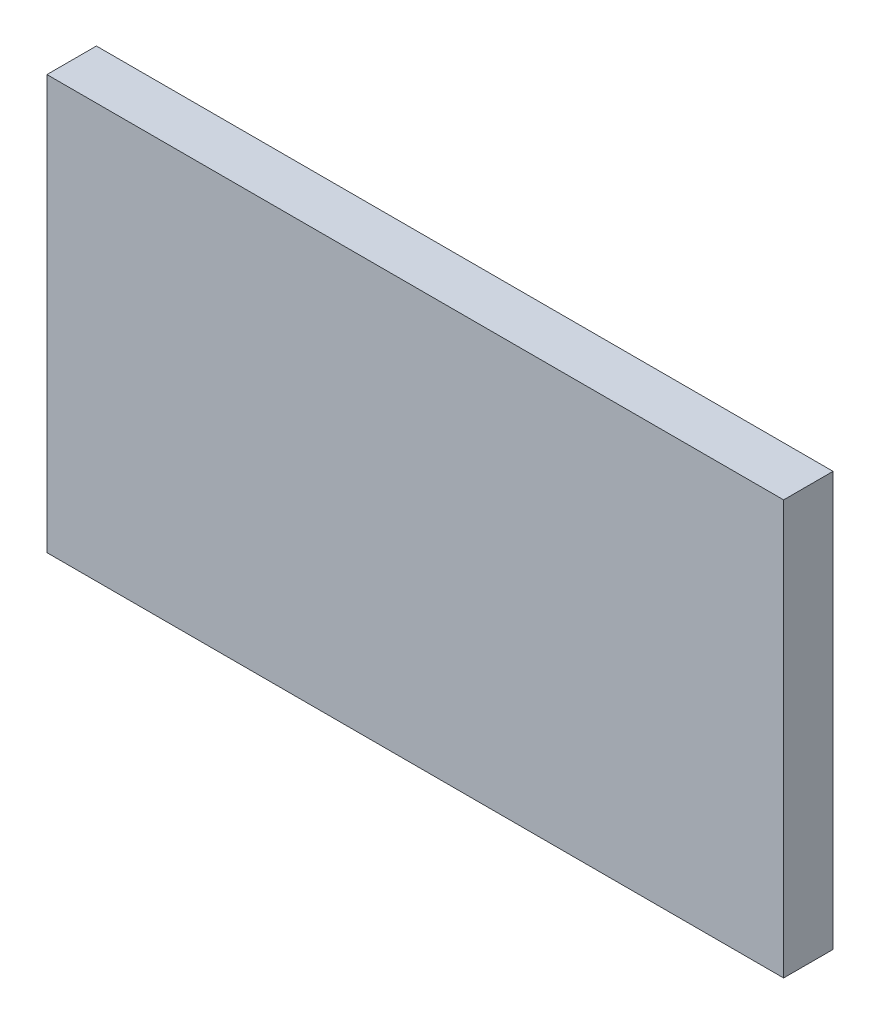
ISO-10303-21;
HEADER;
FILE_DESCRIPTION(('STEP AP214'),'2;1');
FILE_NAME('part.step','',(''),(''),'','','');
FILE_SCHEMA(('AUTOMOTIVE_DESIGN { 1 0 10303 214 1 1 1 1 }'));
ENDSEC;
DATA;
#1=APPLICATION_CONTEXT('core data for automotive mechanical design processes');
#2=APPLICATION_PROTOCOL_DEFINITION('international standard','automotive_design',2000,#1);
#3=PRODUCT_CONTEXT('',#1,'mechanical');
#4=PRODUCT('Part','Part','',(#3));
#5=PRODUCT_RELATED_PRODUCT_CATEGORY('part','',(#4));
#6=PRODUCT_DEFINITION_FORMATION('','',#4);
#7=PRODUCT_DEFINITION_CONTEXT('part definition',#1,'design');
#8=PRODUCT_DEFINITION('design','',#6,#7);
#9=PRODUCT_DEFINITION_SHAPE('','',#8);
#10=(LENGTH_UNIT() NAMED_UNIT(*) SI_UNIT(.MILLI.,.METRE.));
#11=(NAMED_UNIT(*) PLANE_ANGLE_UNIT() SI_UNIT($,.RADIAN.));
#12=(NAMED_UNIT(*) SI_UNIT($,.STERADIAN.) SOLID_ANGLE_UNIT());
#13=UNCERTAINTY_MEASURE_WITH_UNIT(LENGTH_MEASURE(1.E-05),#10,'distance_accuracy_value','');
#14=(GEOMETRIC_REPRESENTATION_CONTEXT(3) GLOBAL_UNCERTAINTY_ASSIGNED_CONTEXT((#13)) GLOBAL_UNIT_ASSIGNED_CONTEXT((#10,
#11,#12)) REPRESENTATION_CONTEXT('',''));
#15=CARTESIAN_POINT('',(0.,0.,0.));
#16=DIRECTION('',(0.,0.,1.));
#17=DIRECTION('',(1.,0.,0.));
#18=AXIS2_PLACEMENT_3D('',#15,#16,#17);
#19=CARTESIAN_POINT('',(-298.,-167.5,40.));
#20=DIRECTION('',(1.,0.,0.));
#21=DIRECTION('',(0.,0.,-1.));
#22=AXIS2_PLACEMENT_3D('',#19,#20,#21);
#23=PLANE('',#22);
#24=DIRECTION('',(0.,-1.,0.));
#25=VECTOR('',#24,1.);
#26=CARTESIAN_POINT('',(-298.,-167.5,0.));
#27=LINE('',#26,#25);
#28=CARTESIAN_POINT('',(-298.,167.5,0.));
#29=VERTEX_POINT('',#28);
#30=CARTESIAN_POINT('',(-298.,-167.5,0.));
#31=VERTEX_POINT('',#30);
#32=EDGE_CURVE('E96',#29,#31,#27,.T.);
#33=ORIENTED_EDGE('',*,*,#32,.T.);
#34=DIRECTION('',(0.,0.,-1.));
#35=VECTOR('',#34,1.);
#36=CARTESIAN_POINT('',(-298.,-167.5,40.));
#37=LINE('',#36,#35);
#38=CARTESIAN_POINT('',(-298.,-167.5,40.));
#39=VERTEX_POINT('',#38);
#40=EDGE_CURVE('E11',#39,#31,#37,.T.);
#41=ORIENTED_EDGE('',*,*,#40,.F.);
#42=DIRECTION('',(0.,-1.,0.));
#43=VECTOR('',#42,1.);
#44=CARTESIAN_POINT('',(-298.,-167.5,40.));
#45=LINE('',#44,#43);
#46=CARTESIAN_POINT('',(-298.,167.5,40.));
#47=VERTEX_POINT('',#46);
#48=EDGE_CURVE('E84',#47,#39,#45,.T.);
#49=ORIENTED_EDGE('',*,*,#48,.F.);
#50=DIRECTION('',(0.,0.,-1.));
#51=VECTOR('',#50,1.);
#52=CARTESIAN_POINT('',(-298.,167.5,40.));
#53=LINE('',#52,#51);
#54=EDGE_CURVE('E92',#47,#29,#53,.T.);
#55=ORIENTED_EDGE('',*,*,#54,.T.);
#56=EDGE_LOOP('',(#33,#41,#49,#55));
#57=FACE_BOUND('',#56,.T.);
#58=ADVANCED_FACE('F33',(#57),#23,.F.);
#59=CARTESIAN_POINT('',(298.,-167.5,40.));
#60=DIRECTION('',(0.,1.,0.));
#61=DIRECTION('',(-1.,0.,0.));
#62=AXIS2_PLACEMENT_3D('',#59,#60,#61);
#63=PLANE('',#62);
#64=DIRECTION('',(1.,0.,0.));
#65=VECTOR('',#64,1.);
#66=CARTESIAN_POINT('',(298.,-167.5,0.));
#67=LINE('',#66,#65);
#68=CARTESIAN_POINT('',(298.,-167.5,0.));
#69=VERTEX_POINT('',#68);
#70=EDGE_CURVE('E88',#31,#69,#67,.T.);
#71=ORIENTED_EDGE('',*,*,#70,.T.);
#72=DIRECTION('',(0.,0.,-1.));
#73=VECTOR('',#72,1.);
#74=CARTESIAN_POINT('',(298.,-167.5,40.));
#75=LINE('',#74,#73);
#76=CARTESIAN_POINT('',(298.,-167.5,40.));
#77=VERTEX_POINT('',#76);
#78=EDGE_CURVE('E41',#77,#69,#75,.T.);
#79=ORIENTED_EDGE('',*,*,#78,.F.);
#80=DIRECTION('',(1.,0.,0.));
#81=VECTOR('',#80,1.);
#82=CARTESIAN_POINT('',(298.,-167.5,40.));
#83=LINE('',#82,#81);
#84=EDGE_CURVE('E79',#39,#77,#83,.T.);
#85=ORIENTED_EDGE('',*,*,#84,.F.);
#86=ORIENTED_EDGE('',*,*,#40,.T.);
#87=EDGE_LOOP('',(#71,#79,#85,#86));
#88=FACE_BOUND('',#87,.T.);
#89=ADVANCED_FACE('F87',(#88),#63,.F.);
#90=CARTESIAN_POINT('',(298.,-167.5,40.));
#91=DIRECTION('',(-1.,0.,0.));
#92=DIRECTION('',(0.,0.,1.));
#93=AXIS2_PLACEMENT_3D('',#90,#91,#92);
#94=PLANE('',#93);
#95=DIRECTION('',(0.,1.,0.));
#96=VECTOR('',#95,1.);
#97=CARTESIAN_POINT('',(298.,-167.5,0.));
#98=LINE('',#97,#96);
#99=CARTESIAN_POINT('',(298.,167.5,0.));
#100=VERTEX_POINT('',#99);
#101=EDGE_CURVE('E66',#69,#100,#98,.T.);
#102=ORIENTED_EDGE('',*,*,#101,.T.);
#103=DIRECTION('',(0.,0.,-1.));
#104=VECTOR('',#103,1.);
#105=CARTESIAN_POINT('',(298.,167.5,40.));
#106=LINE('',#105,#104);
#107=CARTESIAN_POINT('',(298.,167.5,40.));
#108=VERTEX_POINT('',#107);
#109=EDGE_CURVE('E89',#108,#100,#106,.T.);
#110=ORIENTED_EDGE('',*,*,#109,.F.);
#111=DIRECTION('',(0.,1.,0.));
#112=VECTOR('',#111,1.);
#113=CARTESIAN_POINT('',(298.,-167.5,40.));
#114=LINE('',#113,#112);
#115=EDGE_CURVE('E82',#77,#108,#114,.T.);
#116=ORIENTED_EDGE('',*,*,#115,.F.);
#117=ORIENTED_EDGE('',*,*,#78,.T.);
#118=EDGE_LOOP('',(#102,#110,#116,#117));
#119=FACE_BOUND('',#118,.T.);
#120=ADVANCED_FACE('F90',(#119),#94,.F.);
#121=CARTESIAN_POINT('',(298.,167.5,40.));
#122=DIRECTION('',(0.,-1.,0.));
#123=DIRECTION('',(1.,0.,0.));
#124=AXIS2_PLACEMENT_3D('',#121,#122,#123);
#125=PLANE('',#124);
#126=DIRECTION('',(-1.,0.,0.));
#127=VECTOR('',#126,1.);
#128=CARTESIAN_POINT('',(298.,167.5,0.));
#129=LINE('',#128,#127);
#130=EDGE_CURVE('E72',#100,#29,#129,.T.);
#131=ORIENTED_EDGE('',*,*,#130,.T.);
#132=ORIENTED_EDGE('',*,*,#54,.F.);
#133=DIRECTION('',(-1.,0.,0.));
#134=VECTOR('',#133,1.);
#135=CARTESIAN_POINT('',(298.,167.5,40.));
#136=LINE('',#135,#134);
#137=EDGE_CURVE('E49',#108,#47,#136,.T.);
#138=ORIENTED_EDGE('',*,*,#137,.F.);
#139=ORIENTED_EDGE('',*,*,#109,.T.);
#140=EDGE_LOOP('',(#131,#132,#138,#139));
#141=FACE_BOUND('',#140,.T.);
#142=ADVANCED_FACE('F103',(#141),#125,.F.);
#143=CARTESIAN_POINT('',(0.,0.,40.));
#144=DIRECTION('',(0.,0.,1.));
#145=DIRECTION('',(1.,0.,0.));
#146=AXIS2_PLACEMENT_3D('',#143,#144,#145);
#147=PLANE('',#146);
#148=ORIENTED_EDGE('',*,*,#48,.T.);
#149=ORIENTED_EDGE('',*,*,#84,.T.);
#150=ORIENTED_EDGE('',*,*,#115,.T.);
#151=ORIENTED_EDGE('',*,*,#137,.T.);
#152=EDGE_LOOP('',(#148,#149,#150,#151));
#153=FACE_BOUND('',#152,.T.);
#154=ADVANCED_FACE('F80',(#153),#147,.T.);
#155=CARTESIAN_POINT('',(0.,0.,0.));
#156=DIRECTION('',(0.,0.,1.));
#157=DIRECTION('',(1.,0.,0.));
#158=AXIS2_PLACEMENT_3D('',#155,#156,#157);
#159=PLANE('',#158);
#160=ORIENTED_EDGE('',*,*,#32,.F.);
#161=ORIENTED_EDGE('',*,*,#130,.F.);
#162=ORIENTED_EDGE('',*,*,#101,.F.);
#163=ORIENTED_EDGE('',*,*,#70,.F.);
#164=EDGE_LOOP('',(#160,#161,#162,#163));
#165=FACE_BOUND('',#164,.T.);
#166=ADVANCED_FACE('F106',(#165),#159,.F.);
#167=CLOSED_SHELL('',(#58,#89,#120,#142,#154,#166));
#168=MANIFOLD_SOLID_BREP('B2',#167);
#169=ADVANCED_BREP_SHAPE_REPRESENTATION('',(#18,#168),#14);
#170=SHAPE_DEFINITION_REPRESENTATION(#9,#169);
ENDSEC;
END-ISO-10303-21;
